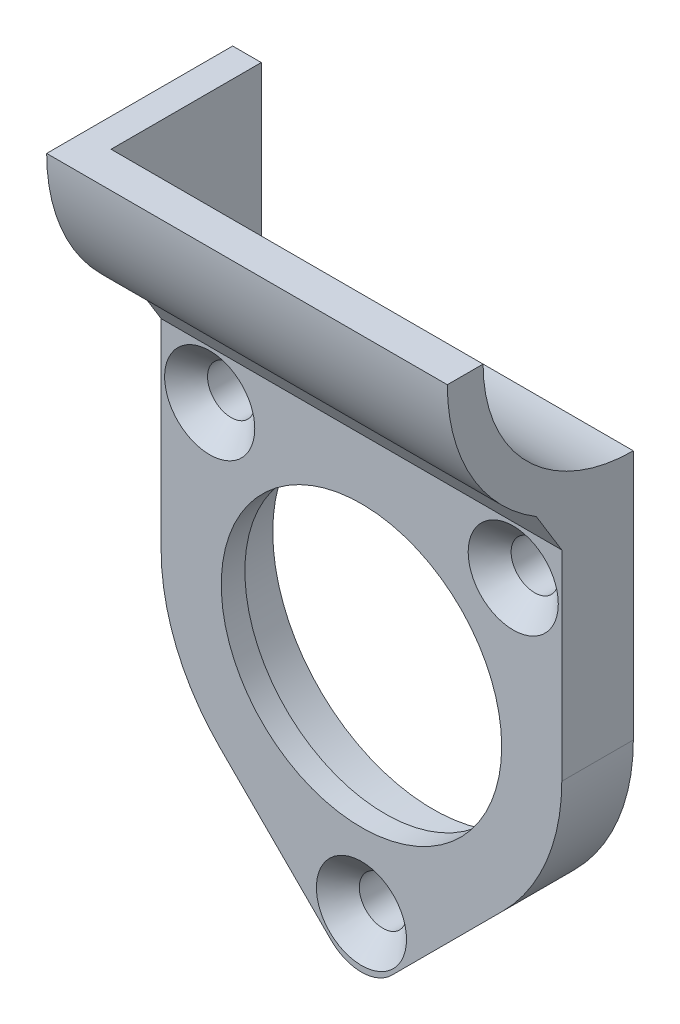
ISO-10303-21;
HEADER;
FILE_DESCRIPTION(('STEP AP214'),'2;1');
FILE_NAME('part.step','',(''),(''),'','','');
FILE_SCHEMA(('AUTOMOTIVE_DESIGN { 1 0 10303 214 1 1 1 1 }'));
ENDSEC;
DATA;
#1=APPLICATION_CONTEXT('core data for automotive mechanical design processes');
#2=APPLICATION_PROTOCOL_DEFINITION('international standard','automotive_design',2000,#1);
#3=PRODUCT_CONTEXT('',#1,'mechanical');
#4=PRODUCT('Part','Part','',(#3));
#5=PRODUCT_RELATED_PRODUCT_CATEGORY('part','',(#4));
#6=PRODUCT_DEFINITION_FORMATION('','',#4);
#7=PRODUCT_DEFINITION_CONTEXT('part definition',#1,'design');
#8=PRODUCT_DEFINITION('design','',#6,#7);
#9=PRODUCT_DEFINITION_SHAPE('','',#8);
#10=(LENGTH_UNIT() NAMED_UNIT(*) SI_UNIT(.MILLI.,.METRE.));
#11=(NAMED_UNIT(*) PLANE_ANGLE_UNIT() SI_UNIT($,.RADIAN.));
#12=(NAMED_UNIT(*) SI_UNIT($,.STERADIAN.) SOLID_ANGLE_UNIT());
#13=UNCERTAINTY_MEASURE_WITH_UNIT(LENGTH_MEASURE(1.E-05),#10,'distance_accuracy_value','');
#14=(GEOMETRIC_REPRESENTATION_CONTEXT(3) GLOBAL_UNCERTAINTY_ASSIGNED_CONTEXT((#13)) GLOBAL_UNIT_ASSIGNED_CONTEXT((#10,
#11,#12)) REPRESENTATION_CONTEXT('',''));
#15=CARTESIAN_POINT('',(0.,0.,0.));
#16=DIRECTION('',(0.,0.,1.));
#17=DIRECTION('',(1.,0.,0.));
#18=AXIS2_PLACEMENT_3D('',#15,#16,#17);
#19=CARTESIAN_POINT('',(-14.,14.,-5.));
#20=DIRECTION('',(-1.,0.,0.));
#21=DIRECTION('',(0.,0.,1.));
#22=AXIS2_PLACEMENT_3D('',#19,#20,#21);
#23=PLANE('',#22);
#24=DIRECTION('',(0.,-0.852873159586999,-0.522118160626586));
#25=VECTOR('',#24,1.);
#26=CARTESIAN_POINT('',(-14.,14.,0.));
#27=LINE('',#26,#25);
#28=CARTESIAN_POINT('',(-14.,16.9082974741917,1.78042292773666));
#29=VERTEX_POINT('',#28);
#30=CARTESIAN_POINT('',(-14.,14.,0.));
#31=VERTEX_POINT('',#30);
#32=EDGE_CURVE('E359',#29,#31,#27,.T.);
#33=ORIENTED_EDGE('',*,*,#32,.F.);
#34=CARTESIAN_POINT('',(-14.,28.,-5.));
#35=DIRECTION('',(-1.,0.,0.));
#36=DIRECTION('',(0.,0.,-1.));
#37=AXIS2_PLACEMENT_3D('',#34,#35,#36);
#38=CIRCLE('',#37,13.);
#39=CARTESIAN_POINT('',(-14.,28.,8.));
#40=VERTEX_POINT('',#39);
#41=EDGE_CURVE('E466',#29,#40,#38,.T.);
#42=ORIENTED_EDGE('',*,*,#41,.T.);
#43=DIRECTION('',(0.,0.,-1.));
#44=VECTOR('',#43,1.);
#45=CARTESIAN_POINT('',(-14.,28.,-5.));
#46=LINE('',#45,#44);
#47=CARTESIAN_POINT('',(-14.,28.,-5.));
#48=VERTEX_POINT('',#47);
#49=EDGE_CURVE('E470',#40,#48,#46,.T.);
#50=ORIENTED_EDGE('',*,*,#49,.T.);
#51=DIRECTION('',(0.,-1.,0.));
#52=VECTOR('',#51,1.);
#53=CARTESIAN_POINT('',(-14.,14.,-5.));
#54=LINE('',#53,#52);
#55=CARTESIAN_POINT('',(-14.,0.,-5.));
#56=VERTEX_POINT('',#55);
#57=EDGE_CURVE('E104',#48,#56,#54,.T.);
#58=ORIENTED_EDGE('',*,*,#57,.T.);
#59=DIRECTION('',(0.,0.,1.));
#60=VECTOR('',#59,1.);
#61=CARTESIAN_POINT('',(-14.,0.,-5.));
#62=LINE('',#61,#60);
#63=CARTESIAN_POINT('',(-14.,0.,0.));
#64=VERTEX_POINT('',#63);
#65=EDGE_CURVE('E151',#56,#64,#62,.T.);
#66=ORIENTED_EDGE('',*,*,#65,.T.);
#67=DIRECTION('',(0.,-1.,0.));
#68=VECTOR('',#67,1.);
#69=CARTESIAN_POINT('',(-14.,14.,0.));
#70=LINE('',#69,#68);
#71=EDGE_CURVE('E152',#31,#64,#70,.T.);
#72=ORIENTED_EDGE('',*,*,#71,.F.);
#73=EDGE_LOOP('',(#33,#42,#50,#58,#66,#72));
#74=FACE_BOUND('',#73,.T.);
#75=ADVANCED_FACE('F47',(#74),#23,.T.);
#76=CARTESIAN_POINT('',(14.,14.,-5.));
#77=DIRECTION('',(1.,0.,0.));
#78=DIRECTION('',(0.,0.,-1.));
#79=AXIS2_PLACEMENT_3D('',#76,#77,#78);
#80=PLANE('',#79);
#81=DIRECTION('',(0.,1.,0.));
#82=VECTOR('',#81,1.);
#83=CARTESIAN_POINT('',(14.,14.,-5.));
#84=LINE('',#83,#82);
#85=CARTESIAN_POINT('',(14.,0.,-5.));
#86=VERTEX_POINT('',#85);
#87=CARTESIAN_POINT('',(14.,17.5,-5.));
#88=VERTEX_POINT('',#87);
#89=EDGE_CURVE('E149',#86,#88,#84,.T.);
#90=ORIENTED_EDGE('',*,*,#89,.T.);
#91=CARTESIAN_POINT('',(14.,28.,-5.));
#92=DIRECTION('',(-1.,0.,0.));
#93=DIRECTION('',(0.,0.,1.));
#94=AXIS2_PLACEMENT_3D('',#91,#92,#93);
#95=CIRCLE('',#94,10.5);
#96=CARTESIAN_POINT('',(14.,28.,5.5));
#97=VERTEX_POINT('',#96);
#98=EDGE_CURVE('E416',#88,#97,#95,.T.);
#99=ORIENTED_EDGE('',*,*,#98,.T.);
#100=DIRECTION('',(0.,0.,1.));
#101=VECTOR('',#100,1.);
#102=CARTESIAN_POINT('',(14.,28.,5.5));
#103=LINE('',#102,#101);
#104=CARTESIAN_POINT('',(14.,28.,8.));
#105=VERTEX_POINT('',#104);
#106=EDGE_CURVE('E433',#97,#105,#103,.T.);
#107=ORIENTED_EDGE('',*,*,#106,.T.);
#108=CARTESIAN_POINT('',(14.,28.,-5.));
#109=DIRECTION('',(1.,0.,0.));
#110=DIRECTION('',(0.,0.,-1.));
#111=AXIS2_PLACEMENT_3D('',#108,#109,#110);
#112=CIRCLE('',#111,13.);
#113=CARTESIAN_POINT('',(14.,16.9082974741917,1.78042292773666));
#114=VERTEX_POINT('',#113);
#115=EDGE_CURVE('E436',#105,#114,#112,.T.);
#116=ORIENTED_EDGE('',*,*,#115,.T.);
#117=DIRECTION('',(0.,-0.852873159586999,-0.522118160626586));
#118=VECTOR('',#117,1.);
#119=CARTESIAN_POINT('',(14.,14.,0.));
#120=LINE('',#119,#118);
#121=CARTESIAN_POINT('',(14.,14.,0.));
#122=VERTEX_POINT('',#121);
#123=EDGE_CURVE('E368',#114,#122,#120,.T.);
#124=ORIENTED_EDGE('',*,*,#123,.T.);
#125=DIRECTION('',(0.,1.,0.));
#126=VECTOR('',#125,1.);
#127=CARTESIAN_POINT('',(14.,14.,0.));
#128=LINE('',#127,#126);
#129=CARTESIAN_POINT('',(14.,0.,0.));
#130=VERTEX_POINT('',#129);
#131=EDGE_CURVE('E96',#130,#122,#128,.T.);
#132=ORIENTED_EDGE('',*,*,#131,.F.);
#133=DIRECTION('',(0.,0.,1.));
#134=VECTOR('',#133,1.);
#135=CARTESIAN_POINT('',(14.,0.,-5.));
#136=LINE('',#135,#134);
#137=EDGE_CURVE('E12',#86,#130,#136,.T.);
#138=ORIENTED_EDGE('',*,*,#137,.F.);
#139=EDGE_LOOP('',(#90,#99,#107,#116,#124,#132,#138));
#140=FACE_BOUND('',#139,.T.);
#141=ADVANCED_FACE('F199',(#140),#80,.T.);
#142=CARTESIAN_POINT('',(0.,0.,-5.));
#143=DIRECTION('',(0.,0.,1.));
#144=DIRECTION('',(1.,0.,0.));
#145=AXIS2_PLACEMENT_3D('',#142,#143,#144);
#146=CYLINDRICAL_SURFACE('',#145,14.);
#147=CARTESIAN_POINT('',(0.,0.,0.));
#148=DIRECTION('',(0.,0.,1.));
#149=DIRECTION('',(1.,0.,0.));
#150=AXIS2_PLACEMENT_3D('',#147,#148,#149);
#151=CIRCLE('',#150,14.);
#152=CARTESIAN_POINT('',(9.89949493661166,-9.89949493661167,0.));
#153=VERTEX_POINT('',#152);
#154=EDGE_CURVE('E165',#153,#130,#151,.T.);
#155=ORIENTED_EDGE('',*,*,#154,.F.);
#156=DIRECTION('',(0.,0.,1.));
#157=VECTOR('',#156,1.);
#158=CARTESIAN_POINT('',(9.89949493661166,-9.89949493661167,-5.));
#159=LINE('',#158,#157);
#160=CARTESIAN_POINT('',(9.89949493661166,-9.89949493661167,-5.));
#161=VERTEX_POINT('',#160);
#162=EDGE_CURVE('E58',#161,#153,#159,.T.);
#163=ORIENTED_EDGE('',*,*,#162,.F.);
#164=CARTESIAN_POINT('',(0.,0.,-5.));
#165=DIRECTION('',(0.,0.,1.));
#166=DIRECTION('',(1.,0.,0.));
#167=AXIS2_PLACEMENT_3D('',#164,#165,#166);
#168=CIRCLE('',#167,14.);
#169=EDGE_CURVE('E139',#161,#86,#168,.T.);
#170=ORIENTED_EDGE('',*,*,#169,.T.);
#171=ORIENTED_EDGE('',*,*,#137,.T.);
#172=EDGE_LOOP('',(#155,#163,#170,#171));
#173=FACE_BOUND('',#172,.T.);
#174=ADVANCED_FACE('F405',(#173),#146,.T.);
#175=CARTESIAN_POINT('',(9.89949493661167,-9.89949493661167,-5.));
#176=DIRECTION('',(0.707106781186548,-0.707106781186548,0.));
#177=DIRECTION('',(0.707106781186548,0.707106781186548,0.));
#178=AXIS2_PLACEMENT_3D('',#175,#176,#177);
#179=PLANE('',#178);
#180=DIRECTION('',(0.707106781186548,0.707106781186548,0.));
#181=VECTOR('',#180,1.);
#182=CARTESIAN_POINT('',(9.89949493661167,-9.89949493661167,0.));
#183=LINE('',#182,#181);
#184=CARTESIAN_POINT('',(2.12189296525723,-17.6770969079661,0.));
#185=VERTEX_POINT('',#184);
#186=EDGE_CURVE('E123',#185,#153,#183,.T.);
#187=ORIENTED_EDGE('',*,*,#186,.F.);
#188=DIRECTION('',(0.,0.,1.));
#189=VECTOR('',#188,1.);
#190=CARTESIAN_POINT('',(2.12189296525723,-17.6770969079661,-5.));
#191=LINE('',#190,#189);
#192=CARTESIAN_POINT('',(2.12189296525723,-17.6770969079661,-5.));
#193=VERTEX_POINT('',#192);
#194=EDGE_CURVE('E118',#193,#185,#191,.T.);
#195=ORIENTED_EDGE('',*,*,#194,.F.);
#196=DIRECTION('',(0.707106781186548,0.707106781186548,0.));
#197=VECTOR('',#196,1.);
#198=CARTESIAN_POINT('',(9.89949493661167,-9.89949493661167,-5.));
#199=LINE('',#198,#197);
#200=EDGE_CURVE('E121',#193,#161,#199,.T.);
#201=ORIENTED_EDGE('',*,*,#200,.T.);
#202=ORIENTED_EDGE('',*,*,#162,.T.);
#203=EDGE_LOOP('',(#187,#195,#201,#202));
#204=FACE_BOUND('',#203,.T.);
#205=ADVANCED_FACE('F120',(#204),#179,.T.);
#206=CARTESIAN_POINT('',(0.,-15.5557765644039,-5.));
#207=DIRECTION('',(0.,0.,1.));
#208=DIRECTION('',(1.,0.,0.));
#209=AXIS2_PLACEMENT_3D('',#206,#207,#208);
#210=CYLINDRICAL_SURFACE('',#209,3.00040493200821);
#211=CARTESIAN_POINT('',(0.,-15.5557765644039,0.));
#212=DIRECTION('',(0.,0.,1.));
#213=DIRECTION('',(1.,0.,0.));
#214=AXIS2_PLACEMENT_3D('',#211,#212,#213);
#215=CIRCLE('',#214,3.00040493200821);
#216=CARTESIAN_POINT('',(-2.12132034355964,-17.6776695296637,0.));
#217=VERTEX_POINT('',#216);
#218=EDGE_CURVE('E162',#217,#185,#215,.T.);
#219=ORIENTED_EDGE('',*,*,#218,.F.);
#220=DIRECTION('',(0.,0.,1.));
#221=VECTOR('',#220,1.);
#222=CARTESIAN_POINT('',(-2.12132034355964,-17.6776695296637,-5.));
#223=LINE('',#222,#221);
#224=CARTESIAN_POINT('',(-2.12132034355964,-17.6776695296637,-5.));
#225=VERTEX_POINT('',#224);
#226=EDGE_CURVE('E128',#225,#217,#223,.T.);
#227=ORIENTED_EDGE('',*,*,#226,.F.);
#228=CARTESIAN_POINT('',(0.,-15.5557765644039,-5.));
#229=DIRECTION('',(0.,0.,1.));
#230=DIRECTION('',(1.,0.,0.));
#231=AXIS2_PLACEMENT_3D('',#228,#229,#230);
#232=CIRCLE('',#231,3.00040493200821);
#233=EDGE_CURVE('E137',#225,#193,#232,.T.);
#234=ORIENTED_EDGE('',*,*,#233,.T.);
#235=ORIENTED_EDGE('',*,*,#194,.T.);
#236=EDGE_LOOP('',(#219,#227,#234,#235));
#237=FACE_BOUND('',#236,.T.);
#238=ADVANCED_FACE('F141',(#237),#210,.T.);
#239=CARTESIAN_POINT('',(-9.89949493661166,-9.89949493661167,-5.));
#240=DIRECTION('',(-0.707106781186548,-0.707106781186548,0.));
#241=DIRECTION('',(0.707106781186548,-0.707106781186548,0.));
#242=AXIS2_PLACEMENT_3D('',#239,#240,#241);
#243=PLANE('',#242);
#244=DIRECTION('',(0.707106781186548,-0.707106781186548,0.));
#245=VECTOR('',#244,1.);
#246=CARTESIAN_POINT('',(-9.89949493661166,-9.89949493661167,0.));
#247=LINE('',#246,#245);
#248=CARTESIAN_POINT('',(-9.89949493661166,-9.89949493661167,0.));
#249=VERTEX_POINT('',#248);
#250=EDGE_CURVE('E159',#249,#217,#247,.T.);
#251=ORIENTED_EDGE('',*,*,#250,.F.);
#252=DIRECTION('',(0.,0.,1.));
#253=VECTOR('',#252,1.);
#254=CARTESIAN_POINT('',(-9.89949493661166,-9.89949493661167,-5.));
#255=LINE('',#254,#253);
#256=CARTESIAN_POINT('',(-9.89949493661166,-9.89949493661167,-5.));
#257=VERTEX_POINT('',#256);
#258=EDGE_CURVE('E172',#257,#249,#255,.T.);
#259=ORIENTED_EDGE('',*,*,#258,.F.);
#260=DIRECTION('',(0.707106781186548,-0.707106781186548,0.));
#261=VECTOR('',#260,1.);
#262=CARTESIAN_POINT('',(-9.89949493661166,-9.89949493661167,-5.));
#263=LINE('',#262,#261);
#264=EDGE_CURVE('E142',#257,#225,#263,.T.);
#265=ORIENTED_EDGE('',*,*,#264,.T.);
#266=ORIENTED_EDGE('',*,*,#226,.T.);
#267=EDGE_LOOP('',(#251,#259,#265,#266));
#268=FACE_BOUND('',#267,.T.);
#269=ADVANCED_FACE('F353',(#268),#243,.T.);
#270=CARTESIAN_POINT('',(0.,0.,-5.));
#271=DIRECTION('',(0.,0.,1.));
#272=DIRECTION('',(1.,0.,0.));
#273=AXIS2_PLACEMENT_3D('',#270,#271,#272);
#274=CYLINDRICAL_SURFACE('',#273,14.);
#275=CARTESIAN_POINT('',(0.,0.,0.));
#276=DIRECTION('',(0.,0.,1.));
#277=DIRECTION('',(-1.,0.,0.));
#278=AXIS2_PLACEMENT_3D('',#275,#276,#277);
#279=CIRCLE('',#278,14.);
#280=EDGE_CURVE('E155',#64,#249,#279,.T.);
#281=ORIENTED_EDGE('',*,*,#280,.F.);
#282=ORIENTED_EDGE('',*,*,#65,.F.);
#283=CARTESIAN_POINT('',(0.,0.,-5.));
#284=DIRECTION('',(0.,0.,1.));
#285=DIRECTION('',(-1.,0.,0.));
#286=AXIS2_PLACEMENT_3D('',#283,#284,#285);
#287=CIRCLE('',#286,14.);
#288=EDGE_CURVE('E144',#56,#257,#287,.T.);
#289=ORIENTED_EDGE('',*,*,#288,.T.);
#290=ORIENTED_EDGE('',*,*,#258,.T.);
#291=EDGE_LOOP('',(#281,#282,#289,#290));
#292=FACE_BOUND('',#291,.T.);
#293=ADVANCED_FACE('F347',(#292),#274,.T.);
#294=CARTESIAN_POINT('',(0.,0.,-5.));
#295=DIRECTION('',(0.,0.,-1.));
#296=DIRECTION('',(-1.,0.,0.));
#297=AXIS2_PLACEMENT_3D('',#294,#295,#296);
#298=PLANE('',#297);
#299=ORIENTED_EDGE('',*,*,#288,.F.);
#300=ORIENTED_EDGE('',*,*,#57,.F.);
#301=DIRECTION('',(-1.,0.,0.));
#302=VECTOR('',#301,1.);
#303=CARTESIAN_POINT('',(-12.,28.,-5.));
#304=LINE('',#303,#302);
#305=CARTESIAN_POINT('',(-12.,28.,-5.));
#306=VERTEX_POINT('',#305);
#307=EDGE_CURVE('E434',#306,#48,#304,.T.);
#308=ORIENTED_EDGE('',*,*,#307,.F.);
#309=DIRECTION('',(0.,-1.,0.));
#310=VECTOR('',#309,1.);
#311=CARTESIAN_POINT('',(-12.,28.,-5.));
#312=LINE('',#311,#310);
#313=CARTESIAN_POINT('',(-12.,17.5,-5.));
#314=VERTEX_POINT('',#313);
#315=EDGE_CURVE('E424',#306,#314,#312,.T.);
#316=ORIENTED_EDGE('',*,*,#315,.T.);
#317=DIRECTION('',(1.,0.,0.));
#318=VECTOR('',#317,1.);
#319=CARTESIAN_POINT('',(-12.,17.5,-5.));
#320=LINE('',#319,#318);
#321=EDGE_CURVE('E372',#314,#88,#320,.T.);
#322=ORIENTED_EDGE('',*,*,#321,.T.);
#323=ORIENTED_EDGE('',*,*,#89,.F.);
#324=ORIENTED_EDGE('',*,*,#169,.F.);
#325=ORIENTED_EDGE('',*,*,#200,.F.);
#326=ORIENTED_EDGE('',*,*,#233,.F.);
#327=ORIENTED_EDGE('',*,*,#264,.F.);
#328=EDGE_LOOP('',(#299,#300,#308,#316,#322,#323,#324,#325,#326,#327));
#329=FACE_BOUND('',#328,.T.);
#330=CARTESIAN_POINT('',(0.,0.,-5.));
#331=DIRECTION('',(0.,0.,-1.));
#332=DIRECTION('',(-1.,0.,0.));
#333=AXIS2_PLACEMENT_3D('',#330,#331,#332);
#334=CIRCLE('',#333,11.19888);
#335=CARTESIAN_POINT('',(-11.19888,0.,-5.));
#336=VERTEX_POINT('',#335);
#337=EDGE_CURVE('E370',#336,#336,#334,.T.);
#338=ORIENTED_EDGE('',*,*,#337,.F.);
#339=EDGE_LOOP('',(#338));
#340=FACE_BOUND('',#339,.T.);
#341=CARTESIAN_POINT('',(-10.6066,10.6066034355961,-5.));
#342=DIRECTION('',(0.,0.,-1.));
#343=DIRECTION('',(-1.,0.,0.));
#344=AXIS2_PLACEMENT_3D('',#341,#342,#343);
#345=CIRCLE('',#344,1.648905);
#346=CARTESIAN_POINT('',(-12.255505,10.6066034355961,-5.));
#347=VERTEX_POINT('',#346);
#348=EDGE_CURVE('E230',#347,#347,#345,.T.);
#349=ORIENTED_EDGE('',*,*,#348,.F.);
#350=EDGE_LOOP('',(#349));
#351=FACE_BOUND('',#350,.T.);
#352=CARTESIAN_POINT('',(10.6066,10.6066034355961,-5.));
#353=DIRECTION('',(0.,0.,-1.));
#354=DIRECTION('',(-1.,0.,0.));
#355=AXIS2_PLACEMENT_3D('',#352,#353,#354);
#356=CIRCLE('',#355,1.648905);
#357=CARTESIAN_POINT('',(8.957695,10.6066034355961,-5.));
#358=VERTEX_POINT('',#357);
#359=EDGE_CURVE('E226',#358,#358,#356,.T.);
#360=ORIENTED_EDGE('',*,*,#359,.F.);
#361=EDGE_LOOP('',(#360));
#362=FACE_BOUND('',#361,.T.);
#363=CARTESIAN_POINT('',(0.,-14.9999965644039,-5.));
#364=DIRECTION('',(0.,0.,-1.));
#365=DIRECTION('',(-1.,0.,0.));
#366=AXIS2_PLACEMENT_3D('',#363,#364,#365);
#367=CIRCLE('',#366,1.65);
#368=CARTESIAN_POINT('',(-1.65,-14.9999965644039,-5.));
#369=VERTEX_POINT('',#368);
#370=EDGE_CURVE('E218',#369,#369,#367,.T.);
#371=ORIENTED_EDGE('',*,*,#370,.F.);
#372=EDGE_LOOP('',(#371));
#373=FACE_BOUND('',#372,.T.);
#374=ADVANCED_FACE('F134',(#329,#340,#351,#362,#373),#298,.T.);
#375=CARTESIAN_POINT('',(0.,0.,0.));
#376=DIRECTION('',(0.,0.,-1.));
#377=DIRECTION('',(-1.,0.,0.));
#378=AXIS2_PLACEMENT_3D('',#375,#376,#377);
#379=PLANE('',#378);
#380=CARTESIAN_POINT('',(0.,-14.9999965644039,0.));
#381=DIRECTION('',(0.,0.,1.));
#382=DIRECTION('',(1.,0.,0.));
#383=AXIS2_PLACEMENT_3D('',#380,#381,#382);
#384=CIRCLE('',#383,3.15);
#385=CARTESIAN_POINT('',(3.15000000000001,-14.9999965644039,0.));
#386=VERTEX_POINT('',#385);
#387=EDGE_CURVE('E214',#386,#386,#384,.T.);
#388=ORIENTED_EDGE('',*,*,#387,.F.);
#389=EDGE_LOOP('',(#388));
#390=FACE_BOUND('',#389,.T.);
#391=CARTESIAN_POINT('',(-10.6066,10.6066034355961,0.));
#392=DIRECTION('',(0.,0.,1.));
#393=DIRECTION('',(1.,0.,0.));
#394=AXIS2_PLACEMENT_3D('',#391,#392,#393);
#395=CIRCLE('',#394,3.14999999999999);
#396=CARTESIAN_POINT('',(-7.45660000000001,10.6066034355961,0.));
#397=VERTEX_POINT('',#396);
#398=EDGE_CURVE('E283',#397,#397,#395,.T.);
#399=ORIENTED_EDGE('',*,*,#398,.F.);
#400=EDGE_LOOP('',(#399));
#401=FACE_BOUND('',#400,.T.);
#402=CARTESIAN_POINT('',(10.6066,10.6066034355961,0.));
#403=DIRECTION('',(0.,0.,-1.));
#404=DIRECTION('',(-1.,0.,0.));
#405=AXIS2_PLACEMENT_3D('',#402,#403,#404);
#406=CIRCLE('',#405,3.14999999999999);
#407=CARTESIAN_POINT('',(7.45660000000001,10.6066034355961,0.));
#408=VERTEX_POINT('',#407);
#409=EDGE_CURVE('E179',#408,#408,#406,.T.);
#410=ORIENTED_EDGE('',*,*,#409,.T.);
#411=EDGE_LOOP('',(#410));
#412=FACE_BOUND('',#411,.T.);
#413=CARTESIAN_POINT('',(0.,0.,0.));
#414=DIRECTION('',(0.,0.,1.));
#415=DIRECTION('',(1.,0.,0.));
#416=AXIS2_PLACEMENT_3D('',#413,#414,#415);
#417=CIRCLE('',#416,9.79888);
#418=CARTESIAN_POINT('',(9.79888,0.,0.));
#419=VERTEX_POINT('',#418);
#420=EDGE_CURVE('E156',#419,#419,#417,.T.);
#421=ORIENTED_EDGE('',*,*,#420,.F.);
#422=EDGE_LOOP('',(#421));
#423=FACE_BOUND('',#422,.T.);
#424=ORIENTED_EDGE('',*,*,#71,.T.);
#425=ORIENTED_EDGE('',*,*,#280,.T.);
#426=ORIENTED_EDGE('',*,*,#250,.T.);
#427=ORIENTED_EDGE('',*,*,#218,.T.);
#428=ORIENTED_EDGE('',*,*,#186,.T.);
#429=ORIENTED_EDGE('',*,*,#154,.T.);
#430=ORIENTED_EDGE('',*,*,#131,.T.);
#431=DIRECTION('',(-1.,0.,0.));
#432=VECTOR('',#431,1.);
#433=CARTESIAN_POINT('',(14.,14.,0.));
#434=LINE('',#433,#432);
#435=EDGE_CURVE('E168',#122,#31,#434,.T.);
#436=ORIENTED_EDGE('',*,*,#435,.T.);
#437=EDGE_LOOP('',(#424,#425,#426,#427,#428,#429,#430,#436));
#438=FACE_BOUND('',#437,.T.);
#439=ADVANCED_FACE('F186',(#390,#401,#412,#423,#438),#379,.F.);
#440=CARTESIAN_POINT('',(0.,0.,-1.65));
#441=DIRECTION('',(0.,0.,1.));
#442=DIRECTION('',(1.,0.,0.));
#443=AXIS2_PLACEMENT_3D('',#440,#441,#442);
#444=CYLINDRICAL_SURFACE('',#443,9.79888);
#445=CARTESIAN_POINT('',(0.,0.,-1.65));
#446=DIRECTION('',(0.,0.,1.));
#447=DIRECTION('',(1.,0.,0.));
#448=AXIS2_PLACEMENT_3D('',#445,#446,#447);
#449=CIRCLE('',#448,9.79888);
#450=CARTESIAN_POINT('',(9.79888,0.,-1.65));
#451=VERTEX_POINT('',#450);
#452=EDGE_CURVE('E338',#451,#451,#449,.T.);
#453=ORIENTED_EDGE('',*,*,#452,.F.);
#454=EDGE_LOOP('',(#453));
#455=FACE_BOUND('',#454,.T.);
#456=ORIENTED_EDGE('',*,*,#420,.T.);
#457=EDGE_LOOP('',(#456));
#458=FACE_BOUND('',#457,.T.);
#459=ADVANCED_FACE('F196',(#455,#458),#444,.F.);
#460=CARTESIAN_POINT('',(10.6066,10.6066034355961,-1.5));
#461=DIRECTION('',(0.,0.,1.));
#462=DIRECTION('',(1.,0.,0.));
#463=AXIS2_PLACEMENT_3D('',#460,#461,#462);
#464=CONICAL_SURFACE('',#463,1.648905,0.785763030204862);
#465=ORIENTED_EDGE('',*,*,#409,.F.);
#466=EDGE_LOOP('',(#465));
#467=FACE_BOUND('',#466,.T.);
#468=CARTESIAN_POINT('',(10.6066,10.6066034355961,-1.5));
#469=DIRECTION('',(0.,0.,1.));
#470=DIRECTION('',(1.,0.,0.));
#471=AXIS2_PLACEMENT_3D('',#468,#469,#470);
#472=CIRCLE('',#471,1.648905);
#473=CARTESIAN_POINT('',(12.255505,10.6066034355961,-1.5));
#474=VERTEX_POINT('',#473);
#475=EDGE_CURVE('E382',#474,#474,#472,.T.);
#476=ORIENTED_EDGE('',*,*,#475,.F.);
#477=EDGE_LOOP('',(#476));
#478=FACE_BOUND('',#477,.T.);
#479=ADVANCED_FACE('F318',(#467,#478),#464,.F.);
#480=CARTESIAN_POINT('',(-8.05819646771892,12.4581269803174,0.));
#481=CARTESIAN_POINT('',(-9.51849292426859,11.8455185621356,-1.5));
#482=CARTESIAN_POINT('',(-4.35514937827635,7.36131991575528,0.));
#483=CARTESIAN_POINT('',(-7.0406626711897,9.66930441067278,-1.5));
#484=CARTESIAN_POINT('',(-9.45195644283851,3.65827282631271,0.));
#485=CARTESIAN_POINT('',(-9.21687682265252,7.19147415759388,-1.5));
#486=CARTESIAN_POINT('',(-13.1550035322811,8.75507989087486,0.));
#487=CARTESIAN_POINT('',(-11.6947070757314,9.3676883090567,-1.5));
#488=CARTESIAN_POINT('',(-16.8580506217237,13.851886955437,0.));
#489=CARTESIAN_POINT('',(-14.1725373288103,11.5439024605195,-1.5));
#490=CARTESIAN_POINT('',(-11.7612435571615,17.5549340448796,0.));
#491=CARTESIAN_POINT('',(-11.9963231773475,14.0217327135984,-1.5));
#492=CARTESIAN_POINT('',(-8.05819646771892,12.4581269803174,0.));
#493=CARTESIAN_POINT('',(-9.51849292426859,11.8455185621356,-1.5));
#494=(BOUNDED_SURFACE() B_SPLINE_SURFACE(3,1,((#480,#481),(#482,#483),(#484,#485),(#486,#487),
(#488,#489),(#490,#491),(#492,#493)),.UNSPECIFIED.,.T.,.F.,.F.) B_SPLINE_SURFACE_WITH_KNOTS((4,
3,4),(2,2),(0.,0.5,1.),(0.,1.),
.UNSPECIFIED.) GEOMETRIC_REPRESENTATION_ITEM() RATIONAL_B_SPLINE_SURFACE(((1.,1.),
(0.333333333333333,0.333333333333333),(0.333333333333333,0.333333333333333),(1.,1.),
(0.333333333333333,0.333333333333333),(0.333333333333333,0.333333333333333),(1.,1.))) REPRESENTATION_ITEM('') SURFACE());
#495=CARTESIAN_POINT('',(-9.51849292426842,11.8455185621357,-1.49999999999982));
#496=CARTESIAN_POINT('',(-7.04066267118938,9.6693044106725,-1.49999999999982));
#497=CARTESIAN_POINT('',(-9.21687682265255,7.19147415759346,-1.49999999999982));
#498=CARTESIAN_POINT('',(-11.6947070757316,9.36768830905663,-1.49999999999982));
#499=CARTESIAN_POINT('',(-14.1725373288106,11.5439024605198,-1.49999999999982));
#500=CARTESIAN_POINT('',(-11.9963231773475,14.0217327135988,-1.49999999999982));
#501=CARTESIAN_POINT('',(-9.51849292426842,11.8455185621357,-1.49999999999982));
#502=(BOUNDED_CURVE() B_SPLINE_CURVE(3,(#495,#496,#497,#498,#499,#500,#501),.UNSPECIFIED.,.T.,
.F.) B_SPLINE_CURVE_WITH_KNOTS((4,3,4),(0.,0.5,1.),
.UNSPECIFIED.) CURVE() GEOMETRIC_REPRESENTATION_ITEM() RATIONAL_B_SPLINE_CURVE((1.,
0.333333333333333,0.333333333333333,1.,0.333333333333333,0.333333333333333,1.)) REPRESENTATION_ITEM(''));
#503=CARTESIAN_POINT('',(-9.51849292426842,11.8455185621357,-1.49999999999982));
#504=VERTEX_POINT('',#503);
#505=EDGE_CURVE('E227',#504,#504,#502,.F.);
#506=ORIENTED_EDGE('',*,*,#398,.T.);
#507=EDGE_LOOP('',(#506));
#508=FACE_BOUND('',#507,.T.);
#509=ORIENTED_EDGE('',*,*,#505,.F.);
#510=EDGE_LOOP('',(#509));
#511=FACE_BOUND('',#510,.T.);
#512=ADVANCED_FACE('F261',(#508,#511),#494,.F.);
#513=CARTESIAN_POINT('',(0.,-14.9999965644039,-1.5));
#514=DIRECTION('',(0.,0.,1.));
#515=DIRECTION('',(1.,0.,0.));
#516=AXIS2_PLACEMENT_3D('',#513,#514,#515);
#517=CONICAL_SURFACE('',#516,1.65,0.785398163397448);
#518=ORIENTED_EDGE('',*,*,#387,.T.);
#519=EDGE_LOOP('',(#518));
#520=FACE_BOUND('',#519,.T.);
#521=CARTESIAN_POINT('',(0.,-14.9999965644039,-1.5));
#522=DIRECTION('',(0.,0.,1.));
#523=DIRECTION('',(1.,0.,0.));
#524=AXIS2_PLACEMENT_3D('',#521,#522,#523);
#525=CIRCLE('',#524,1.65);
#526=CARTESIAN_POINT('',(1.65000000000001,-14.9999965644039,-1.5));
#527=VERTEX_POINT('',#526);
#528=EDGE_CURVE('E237',#527,#527,#525,.T.);
#529=ORIENTED_EDGE('',*,*,#528,.F.);
#530=EDGE_LOOP('',(#529));
#531=FACE_BOUND('',#530,.T.);
#532=ADVANCED_FACE('F254',(#520,#531),#517,.F.);
#533=CARTESIAN_POINT('',(0.,-14.9999965644039,-6.5));
#534=DIRECTION('',(0.,0.,1.));
#535=DIRECTION('',(1.,0.,0.));
#536=AXIS2_PLACEMENT_3D('',#533,#534,#535);
#537=CYLINDRICAL_SURFACE('',#536,1.65);
#538=ORIENTED_EDGE('',*,*,#370,.T.);
#539=EDGE_LOOP('',(#538));
#540=FACE_BOUND('',#539,.T.);
#541=ORIENTED_EDGE('',*,*,#528,.T.);
#542=EDGE_LOOP('',(#541));
#543=FACE_BOUND('',#542,.T.);
#544=ADVANCED_FACE('F244',(#540,#543),#537,.F.);
#545=CARTESIAN_POINT('',(10.6066,10.6066034355961,-6.5));
#546=DIRECTION('',(0.,0.,1.));
#547=DIRECTION('',(1.,0.,0.));
#548=AXIS2_PLACEMENT_3D('',#545,#546,#547);
#549=CYLINDRICAL_SURFACE('',#548,1.648905);
#550=ORIENTED_EDGE('',*,*,#359,.T.);
#551=EDGE_LOOP('',(#550));
#552=FACE_BOUND('',#551,.T.);
#553=ORIENTED_EDGE('',*,*,#475,.T.);
#554=EDGE_LOOP('',(#553));
#555=FACE_BOUND('',#554,.T.);
#556=ADVANCED_FACE('F253',(#552,#555),#549,.F.);
#557=CARTESIAN_POINT('',(-10.6066,10.6066034355961,-6.5));
#558=DIRECTION('',(0.,0.,1.));
#559=DIRECTION('',(1.,0.,0.));
#560=AXIS2_PLACEMENT_3D('',#557,#558,#559);
#561=CYLINDRICAL_SURFACE('',#560,1.648905);
#562=ORIENTED_EDGE('',*,*,#348,.T.);
#563=EDGE_LOOP('',(#562));
#564=FACE_BOUND('',#563,.T.);
#565=ORIENTED_EDGE('',*,*,#505,.T.);
#566=EDGE_LOOP('',(#565));
#567=FACE_BOUND('',#566,.T.);
#568=ADVANCED_FACE('F386',(#564,#567),#561,.F.);
#569=CARTESIAN_POINT('',(0.,0.,-1.65));
#570=DIRECTION('',(0.,0.,-1.));
#571=DIRECTION('',(-1.,0.,0.));
#572=AXIS2_PLACEMENT_3D('',#569,#570,#571);
#573=PLANE('',#572);
#574=CARTESIAN_POINT('',(0.,0.,-1.65));
#575=DIRECTION('',(0.,0.,-1.));
#576=DIRECTION('',(-1.,0.,0.));
#577=AXIS2_PLACEMENT_3D('',#574,#575,#576);
#578=CIRCLE('',#577,11.19888);
#579=CARTESIAN_POINT('',(-11.19888,0.,-1.65));
#580=VERTEX_POINT('',#579);
#581=EDGE_CURVE('E341',#580,#580,#578,.T.);
#582=ORIENTED_EDGE('',*,*,#581,.T.);
#583=EDGE_LOOP('',(#582));
#584=FACE_BOUND('',#583,.T.);
#585=ORIENTED_EDGE('',*,*,#452,.T.);
#586=EDGE_LOOP('',(#585));
#587=FACE_BOUND('',#586,.T.);
#588=ADVANCED_FACE('F388',(#584,#587),#573,.T.);
#589=CARTESIAN_POINT('',(0.,0.,-1.65));
#590=DIRECTION('',(0.,0.,-1.));
#591=DIRECTION('',(-1.,0.,0.));
#592=AXIS2_PLACEMENT_3D('',#589,#590,#591);
#593=CYLINDRICAL_SURFACE('',#592,11.19888);
#594=ORIENTED_EDGE('',*,*,#581,.F.);
#595=EDGE_LOOP('',(#594));
#596=FACE_BOUND('',#595,.T.);
#597=ORIENTED_EDGE('',*,*,#337,.T.);
#598=EDGE_LOOP('',(#597));
#599=FACE_BOUND('',#598,.T.);
#600=ADVANCED_FACE('F394',(#596,#599),#593,.F.);
#601=CARTESIAN_POINT('',(-14.,14.,0.));
#602=DIRECTION('',(0.,-0.522118160626586,0.852873159586999));
#603=DIRECTION('',(0.,-0.852873159586999,-0.522118160626586));
#604=AXIS2_PLACEMENT_3D('',#601,#602,#603);
#605=PLANE('',#604);
#606=ORIENTED_EDGE('',*,*,#123,.F.);
#607=DIRECTION('',(1.,0.,0.));
#608=VECTOR('',#607,1.);
#609=CARTESIAN_POINT('',(-14.,16.9082974741917,1.78042292773666));
#610=LINE('',#609,#608);
#611=EDGE_CURVE('E366',#29,#114,#610,.T.);
#612=ORIENTED_EDGE('',*,*,#611,.F.);
#613=ORIENTED_EDGE('',*,*,#32,.T.);
#614=ORIENTED_EDGE('',*,*,#435,.F.);
#615=EDGE_LOOP('',(#606,#612,#613,#614));
#616=FACE_BOUND('',#615,.T.);
#617=ADVANCED_FACE('F363',(#616),#605,.T.);
#618=CARTESIAN_POINT('',(-12.,28.,-5.));
#619=DIRECTION('',(1.,0.,0.));
#620=DIRECTION('',(0.,0.,-1.));
#621=AXIS2_PLACEMENT_3D('',#618,#619,#620);
#622=CYLINDRICAL_SURFACE('',#621,10.5);
#623=ORIENTED_EDGE('',*,*,#98,.F.);
#624=ORIENTED_EDGE('',*,*,#321,.F.);
#625=CARTESIAN_POINT('',(-12.,28.,-5.));
#626=DIRECTION('',(-1.,0.,0.));
#627=DIRECTION('',(0.,0.,1.));
#628=AXIS2_PLACEMENT_3D('',#625,#626,#627);
#629=CIRCLE('',#628,10.5);
#630=CARTESIAN_POINT('',(-12.,28.,5.5));
#631=VERTEX_POINT('',#630);
#632=EDGE_CURVE('E440',#314,#631,#629,.T.);
#633=ORIENTED_EDGE('',*,*,#632,.T.);
#634=DIRECTION('',(1.,0.,0.));
#635=VECTOR('',#634,1.);
#636=CARTESIAN_POINT('',(-12.,28.,5.5));
#637=LINE('',#636,#635);
#638=EDGE_CURVE('E375',#631,#97,#637,.T.);
#639=ORIENTED_EDGE('',*,*,#638,.T.);
#640=EDGE_LOOP('',(#623,#624,#633,#639));
#641=FACE_BOUND('',#640,.T.);
#642=ADVANCED_FACE('F430',(#641),#622,.F.);
#643=CARTESIAN_POINT('',(-12.,28.,-5.));
#644=DIRECTION('',(1.,0.,0.));
#645=DIRECTION('',(0.,0.,-1.));
#646=AXIS2_PLACEMENT_3D('',#643,#644,#645);
#647=CYLINDRICAL_SURFACE('',#646,13.);
#648=ORIENTED_EDGE('',*,*,#41,.F.);
#649=ORIENTED_EDGE('',*,*,#611,.T.);
#650=ORIENTED_EDGE('',*,*,#115,.F.);
#651=DIRECTION('',(1.,0.,0.));
#652=VECTOR('',#651,1.);
#653=CARTESIAN_POINT('',(-12.,28.,8.));
#654=LINE('',#653,#652);
#655=EDGE_CURVE('E427',#40,#105,#654,.T.);
#656=ORIENTED_EDGE('',*,*,#655,.F.);
#657=EDGE_LOOP('',(#648,#649,#650,#656));
#658=FACE_BOUND('',#657,.T.);
#659=ADVANCED_FACE('F465',(#658),#647,.T.);
#660=CARTESIAN_POINT('',(-12.,28.,5.5));
#661=DIRECTION('',(0.,1.,0.));
#662=DIRECTION('',(0.,0.,1.));
#663=AXIS2_PLACEMENT_3D('',#660,#661,#662);
#664=PLANE('',#663);
#665=ORIENTED_EDGE('',*,*,#106,.F.);
#666=ORIENTED_EDGE('',*,*,#638,.F.);
#667=DIRECTION('',(0.,0.,-1.));
#668=VECTOR('',#667,1.);
#669=CARTESIAN_POINT('',(-12.,28.,-5.));
#670=LINE('',#669,#668);
#671=EDGE_CURVE('E455',#631,#306,#670,.T.);
#672=ORIENTED_EDGE('',*,*,#671,.T.);
#673=ORIENTED_EDGE('',*,*,#307,.T.);
#674=ORIENTED_EDGE('',*,*,#49,.F.);
#675=ORIENTED_EDGE('',*,*,#655,.T.);
#676=EDGE_LOOP('',(#665,#666,#672,#673,#674,#675));
#677=FACE_BOUND('',#676,.T.);
#678=ADVANCED_FACE('F467',(#677),#664,.T.);
#679=CARTESIAN_POINT('',(-12.,28.,-5.));
#680=DIRECTION('',(1.,0.,0.));
#681=DIRECTION('',(0.,0.,-1.));
#682=AXIS2_PLACEMENT_3D('',#679,#680,#681);
#683=PLANE('',#682);
#684=ORIENTED_EDGE('',*,*,#632,.F.);
#685=ORIENTED_EDGE('',*,*,#315,.F.);
#686=ORIENTED_EDGE('',*,*,#671,.F.);
#687=EDGE_LOOP('',(#684,#685,#686));
#688=FACE_BOUND('',#687,.T.);
#689=ADVANCED_FACE('F452',(#688),#683,.T.);
#690=CLOSED_SHELL('',(#75,#141,#174,#205,#238,#269,#293,#374,#439,#459,#479,#512,#532,#544,#556,
#568,#588,#600,#617,#642,#659,#678,#689));
#691=MANIFOLD_SOLID_BREP('B2',#690);
#692=ADVANCED_BREP_SHAPE_REPRESENTATION('',(#18,#691),#14);
#693=SHAPE_DEFINITION_REPRESENTATION(#9,#692);
ENDSEC;
END-ISO-10303-21;
